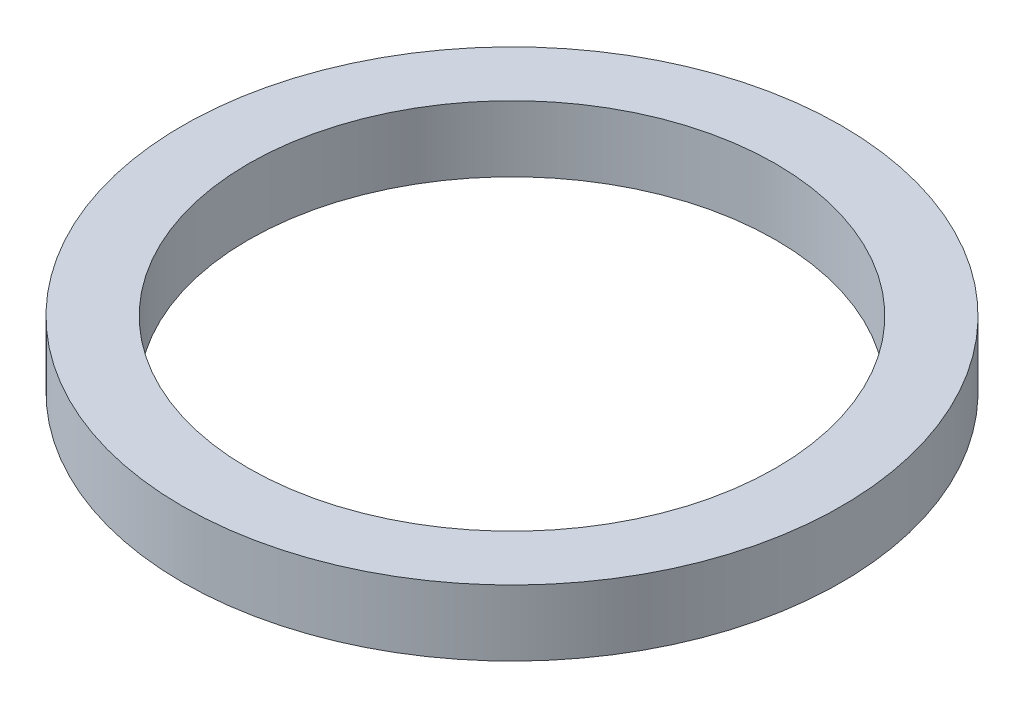
ISO-10303-21;
HEADER;
FILE_DESCRIPTION(('STEP AP214'),'2;1');
FILE_NAME('part.step','',(''),(''),'','','');
FILE_SCHEMA(('AUTOMOTIVE_DESIGN { 1 0 10303 214 1 1 1 1 }'));
ENDSEC;
DATA;
#1=APPLICATION_CONTEXT('core data for automotive mechanical design processes');
#2=APPLICATION_PROTOCOL_DEFINITION('international standard','automotive_design',2000,#1);
#3=PRODUCT_CONTEXT('',#1,'mechanical');
#4=PRODUCT('Part','Part','',(#3));
#5=PRODUCT_RELATED_PRODUCT_CATEGORY('part','',(#4));
#6=PRODUCT_DEFINITION_FORMATION('','',#4);
#7=PRODUCT_DEFINITION_CONTEXT('part definition',#1,'design');
#8=PRODUCT_DEFINITION('design','',#6,#7);
#9=PRODUCT_DEFINITION_SHAPE('','',#8);
#10=(LENGTH_UNIT() NAMED_UNIT(*) SI_UNIT(.MILLI.,.METRE.));
#11=(NAMED_UNIT(*) PLANE_ANGLE_UNIT() SI_UNIT($,.RADIAN.));
#12=(NAMED_UNIT(*) SI_UNIT($,.STERADIAN.) SOLID_ANGLE_UNIT());
#13=UNCERTAINTY_MEASURE_WITH_UNIT(LENGTH_MEASURE(1.E-05),#10,'distance_accuracy_value','');
#14=(GEOMETRIC_REPRESENTATION_CONTEXT(3) GLOBAL_UNCERTAINTY_ASSIGNED_CONTEXT((#13)) GLOBAL_UNIT_ASSIGNED_CONTEXT((#10,
#11,#12)) REPRESENTATION_CONTEXT('',''));
#15=CARTESIAN_POINT('',(0.,0.,0.));
#16=DIRECTION('',(0.,0.,1.));
#17=DIRECTION('',(1.,0.,0.));
#18=AXIS2_PLACEMENT_3D('',#15,#16,#17);
#19=CARTESIAN_POINT('',(0.,3.175,0.));
#20=DIRECTION('',(0.,1.,0.));
#21=DIRECTION('',(0.,0.,1.));
#22=AXIS2_PLACEMENT_3D('',#19,#20,#21);
#23=PLANE('',#22);
#24=CARTESIAN_POINT('',(0.,3.175,0.));
#25=DIRECTION('',(0.,1.,0.));
#26=DIRECTION('',(0.,0.,1.));
#27=AXIS2_PLACEMENT_3D('',#24,#25,#26);
#28=CIRCLE('',#27,15.875);
#29=CARTESIAN_POINT('',(0.,3.175,15.875));
#30=VERTEX_POINT('',#29);
#31=EDGE_CURVE('E10',#30,#30,#28,.T.);
#32=ORIENTED_EDGE('',*,*,#31,.T.);
#33=EDGE_LOOP('',(#32));
#34=FACE_BOUND('',#33,.T.);
#35=CARTESIAN_POINT('',(0.,3.175,0.));
#36=DIRECTION('',(0.,1.,0.));
#37=DIRECTION('',(0.,0.,1.));
#38=AXIS2_PLACEMENT_3D('',#35,#36,#37);
#39=CIRCLE('',#38,12.7);
#40=CARTESIAN_POINT('',(0.,3.175,12.7));
#41=VERTEX_POINT('',#40);
#42=EDGE_CURVE('E50',#41,#41,#39,.T.);
#43=ORIENTED_EDGE('',*,*,#42,.F.);
#44=EDGE_LOOP('',(#43));
#45=FACE_BOUND('',#44,.T.);
#46=ADVANCED_FACE('F39',(#34,#45),#23,.T.);
#47=CARTESIAN_POINT('',(0.,0.,0.));
#48=DIRECTION('',(0.,1.,0.));
#49=DIRECTION('',(0.,0.,1.));
#50=AXIS2_PLACEMENT_3D('',#47,#48,#49);
#51=PLANE('',#50);
#52=CARTESIAN_POINT('',(0.,0.,0.));
#53=DIRECTION('',(0.,1.,0.));
#54=DIRECTION('',(0.,0.,1.));
#55=AXIS2_PLACEMENT_3D('',#52,#53,#54);
#56=CIRCLE('',#55,15.875);
#57=CARTESIAN_POINT('',(0.,0.,15.875));
#58=VERTEX_POINT('',#57);
#59=EDGE_CURVE('E43',#58,#58,#56,.T.);
#60=ORIENTED_EDGE('',*,*,#59,.F.);
#61=EDGE_LOOP('',(#60));
#62=FACE_BOUND('',#61,.T.);
#63=CARTESIAN_POINT('',(0.,0.,0.));
#64=DIRECTION('',(0.,1.,0.));
#65=DIRECTION('',(0.,0.,1.));
#66=AXIS2_PLACEMENT_3D('',#63,#64,#65);
#67=CIRCLE('',#66,12.7);
#68=CARTESIAN_POINT('',(0.,0.,12.7));
#69=VERTEX_POINT('',#68);
#70=EDGE_CURVE('E52',#69,#69,#67,.T.);
#71=ORIENTED_EDGE('',*,*,#70,.T.);
#72=EDGE_LOOP('',(#71));
#73=FACE_BOUND('',#72,.T.);
#74=ADVANCED_FACE('F62',(#62,#73),#51,.F.);
#75=CARTESIAN_POINT('',(0.,3.175,0.));
#76=DIRECTION('',(0.,-1.,0.));
#77=DIRECTION('',(0.,0.,-1.));
#78=AXIS2_PLACEMENT_3D('',#75,#76,#77);
#79=CYLINDRICAL_SURFACE('',#78,15.875);
#80=ORIENTED_EDGE('',*,*,#31,.F.);
#81=EDGE_LOOP('',(#80));
#82=FACE_BOUND('',#81,.T.);
#83=ORIENTED_EDGE('',*,*,#59,.T.);
#84=EDGE_LOOP('',(#83));
#85=FACE_BOUND('',#84,.T.);
#86=ADVANCED_FACE('F41',(#82,#85),#79,.T.);
#87=CARTESIAN_POINT('',(0.,3.175,0.));
#88=DIRECTION('',(0.,-1.,0.));
#89=DIRECTION('',(0.,0.,-1.));
#90=AXIS2_PLACEMENT_3D('',#87,#88,#89);
#91=CYLINDRICAL_SURFACE('',#90,12.7);
#92=ORIENTED_EDGE('',*,*,#42,.T.);
#93=EDGE_LOOP('',(#92));
#94=FACE_BOUND('',#93,.T.);
#95=ORIENTED_EDGE('',*,*,#70,.F.);
#96=EDGE_LOOP('',(#95));
#97=FACE_BOUND('',#96,.T.);
#98=ADVANCED_FACE('F58',(#94,#97),#91,.F.);
#99=CLOSED_SHELL('',(#46,#74,#86,#98));
#100=MANIFOLD_SOLID_BREP('B2',#99);
#101=ADVANCED_BREP_SHAPE_REPRESENTATION('',(#18,#100),#14);
#102=SHAPE_DEFINITION_REPRESENTATION(#9,#101);
ENDSEC;
END-ISO-10303-21;
